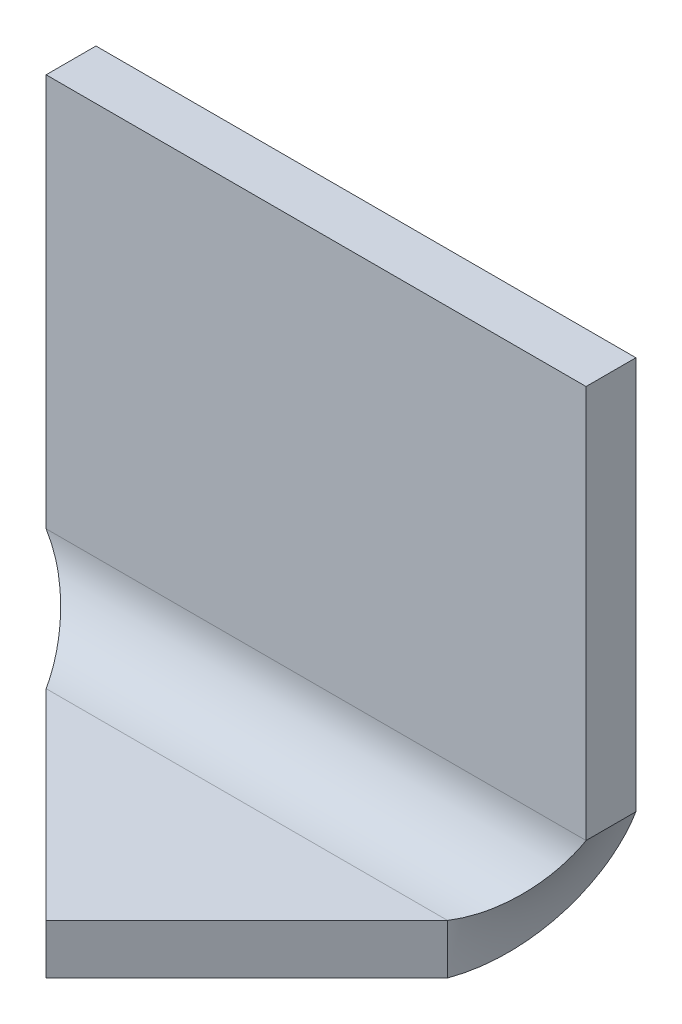
ISO-10303-21;
HEADER;
FILE_DESCRIPTION(('STEP AP214'),'2;1');
FILE_NAME('part.step','',(''),(''),'','','');
FILE_SCHEMA(('AUTOMOTIVE_DESIGN { 1 0 10303 214 1 1 1 1 }'));
ENDSEC;
DATA;
#1=APPLICATION_CONTEXT('core data for automotive mechanical design processes');
#2=APPLICATION_PROTOCOL_DEFINITION('international standard','automotive_design',2000,#1);
#3=PRODUCT_CONTEXT('',#1,'mechanical');
#4=PRODUCT('Part','Part','',(#3));
#5=PRODUCT_RELATED_PRODUCT_CATEGORY('part','',(#4));
#6=PRODUCT_DEFINITION_FORMATION('','',#4);
#7=PRODUCT_DEFINITION_CONTEXT('part definition',#1,'design');
#8=PRODUCT_DEFINITION('design','',#6,#7);
#9=PRODUCT_DEFINITION_SHAPE('','',#8);
#10=(LENGTH_UNIT() NAMED_UNIT(*) SI_UNIT(.MILLI.,.METRE.));
#11=(NAMED_UNIT(*) PLANE_ANGLE_UNIT() SI_UNIT($,.RADIAN.));
#12=(NAMED_UNIT(*) SI_UNIT($,.STERADIAN.) SOLID_ANGLE_UNIT());
#13=UNCERTAINTY_MEASURE_WITH_UNIT(LENGTH_MEASURE(1.E-05),#10,'distance_accuracy_value','');
#14=(GEOMETRIC_REPRESENTATION_CONTEXT(3) GLOBAL_UNCERTAINTY_ASSIGNED_CONTEXT((#13)) GLOBAL_UNIT_ASSIGNED_CONTEXT((#10,
#11,#12)) REPRESENTATION_CONTEXT('',''));
#15=CARTESIAN_POINT('',(0.,0.,0.));
#16=DIRECTION('',(0.,0.,1.));
#17=DIRECTION('',(1.,0.,0.));
#18=AXIS2_PLACEMENT_3D('',#15,#16,#17);
#19=CARTESIAN_POINT('',(9.75,8.35,-1.8));
#20=DIRECTION('',(1.,0.,0.));
#21=DIRECTION('',(0.,1.,0.));
#22=AXIS2_PLACEMENT_3D('',#19,#20,#21);
#23=PLANE('',#22);
#24=DIRECTION('',(0.,1.,0.));
#25=VECTOR('',#24,1.);
#26=CARTESIAN_POINT('',(9.75,8.35,0.));
#27=LINE('',#26,#25);
#28=CARTESIAN_POINT('',(9.75000000000001,-5.85,0.));
#29=VERTEX_POINT('',#28);
#30=CARTESIAN_POINT('',(9.75,8.35,0.));
#31=VERTEX_POINT('',#30);
#32=EDGE_CURVE('E88',#29,#31,#27,.T.);
#33=ORIENTED_EDGE('',*,*,#32,.F.);
#34=DIRECTION('',(0.,0.,-1.));
#35=VECTOR('',#34,1.);
#36=CARTESIAN_POINT('',(9.75000000000001,-5.85,0.));
#37=LINE('',#36,#35);
#38=CARTESIAN_POINT('',(9.75000000000001,-5.85,-1.8));
#39=VERTEX_POINT('',#38);
#40=EDGE_CURVE('E146',#29,#39,#37,.T.);
#41=ORIENTED_EDGE('',*,*,#40,.T.);
#42=DIRECTION('',(0.,1.,0.));
#43=VECTOR('',#42,1.);
#44=CARTESIAN_POINT('',(9.75,8.35,-1.8));
#45=LINE('',#44,#43);
#46=CARTESIAN_POINT('',(9.75,8.35,-1.8));
#47=VERTEX_POINT('',#46);
#48=EDGE_CURVE('E85',#39,#47,#45,.T.);
#49=ORIENTED_EDGE('',*,*,#48,.T.);
#50=DIRECTION('',(0.,0.,1.));
#51=VECTOR('',#50,1.);
#52=CARTESIAN_POINT('',(9.75,8.35,-1.8));
#53=LINE('',#52,#51);
#54=EDGE_CURVE('E43',#47,#31,#53,.T.);
#55=ORIENTED_EDGE('',*,*,#54,.T.);
#56=EDGE_LOOP('',(#33,#41,#49,#55));
#57=FACE_BOUND('',#56,.T.);
#58=ADVANCED_FACE('F40',(#57),#23,.T.);
#59=CARTESIAN_POINT('',(9.75000000000001,-8.35,-1.8));
#60=DIRECTION('',(0.,0.,1.));
#61=DIRECTION('',(1.,0.,0.));
#62=AXIS2_PLACEMENT_3D('',#59,#60,#61);
#63=PLANE('',#62);
#64=DIRECTION('',(1.,0.,0.));
#65=VECTOR('',#64,1.);
#66=CARTESIAN_POINT('',(9.75000000000001,-5.85,-1.8));
#67=LINE('',#66,#65);
#68=CARTESIAN_POINT('',(-9.74999999999999,-5.84999999999999,-1.8));
#69=VERTEX_POINT('',#68);
#70=EDGE_CURVE('E147',#39,#69,#67,.F.);
#71=ORIENTED_EDGE('',*,*,#70,.T.);
#72=DIRECTION('',(0.,-1.,0.));
#73=VECTOR('',#72,1.);
#74=CARTESIAN_POINT('',(-9.75,8.35,-1.8));
#75=LINE('',#74,#73);
#76=CARTESIAN_POINT('',(-9.75,8.35,-1.8));
#77=VERTEX_POINT('',#76);
#78=EDGE_CURVE('E93',#77,#69,#75,.T.);
#79=ORIENTED_EDGE('',*,*,#78,.F.);
#80=DIRECTION('',(-1.,0.,0.));
#81=VECTOR('',#80,1.);
#82=CARTESIAN_POINT('',(-9.75,8.35,-1.8));
#83=LINE('',#82,#81);
#84=EDGE_CURVE('E78',#47,#77,#83,.T.);
#85=ORIENTED_EDGE('',*,*,#84,.F.);
#86=ORIENTED_EDGE('',*,*,#48,.F.);
#87=EDGE_LOOP('',(#71,#79,#85,#86));
#88=FACE_BOUND('',#87,.T.);
#89=ADVANCED_FACE('F181',(#88),#63,.F.);
#90=CARTESIAN_POINT('',(9.75000000000001,-8.35,0.));
#91=DIRECTION('',(0.,0.,1.));
#92=DIRECTION('',(1.,0.,0.));
#93=AXIS2_PLACEMENT_3D('',#90,#91,#92);
#94=PLANE('',#93);
#95=DIRECTION('',(0.,-1.,0.));
#96=VECTOR('',#95,1.);
#97=CARTESIAN_POINT('',(-9.75,8.35,0.));
#98=LINE('',#97,#96);
#99=CARTESIAN_POINT('',(-9.75,8.35,0.));
#100=VERTEX_POINT('',#99);
#101=CARTESIAN_POINT('',(-9.74999999999999,-5.85,0.));
#102=VERTEX_POINT('',#101);
#103=EDGE_CURVE('E80',#100,#102,#98,.T.);
#104=ORIENTED_EDGE('',*,*,#103,.T.);
#105=DIRECTION('',(1.,0.,0.));
#106=VECTOR('',#105,1.);
#107=CARTESIAN_POINT('',(9.75000000000001,-5.85,0.));
#108=LINE('',#107,#106);
#109=EDGE_CURVE('E54',#29,#102,#108,.F.);
#110=ORIENTED_EDGE('',*,*,#109,.F.);
#111=ORIENTED_EDGE('',*,*,#32,.T.);
#112=DIRECTION('',(-1.,0.,0.));
#113=VECTOR('',#112,1.);
#114=CARTESIAN_POINT('',(-9.75,8.35,0.));
#115=LINE('',#114,#113);
#116=EDGE_CURVE('E76',#31,#100,#115,.T.);
#117=ORIENTED_EDGE('',*,*,#116,.T.);
#118=EDGE_LOOP('',(#104,#110,#111,#117));
#119=FACE_BOUND('',#118,.T.);
#120=ADVANCED_FACE('F87',(#119),#94,.T.);
#121=CARTESIAN_POINT('',(-9.75,8.35,-1.8));
#122=DIRECTION('',(-1.,0.,0.));
#123=DIRECTION('',(0.,-1.,0.));
#124=AXIS2_PLACEMENT_3D('',#121,#122,#123);
#125=PLANE('',#124);
#126=DIRECTION('',(0.,0.,-1.));
#127=VECTOR('',#126,1.);
#128=CARTESIAN_POINT('',(-9.74999999999999,-5.85,0.));
#129=LINE('',#128,#127);
#130=EDGE_CURVE('E84',#102,#69,#129,.T.);
#131=ORIENTED_EDGE('',*,*,#130,.F.);
#132=ORIENTED_EDGE('',*,*,#103,.F.);
#133=DIRECTION('',(0.,0.,1.));
#134=VECTOR('',#133,1.);
#135=CARTESIAN_POINT('',(-9.75,8.35,-1.8));
#136=LINE('',#135,#134);
#137=EDGE_CURVE('E11',#77,#100,#136,.T.);
#138=ORIENTED_EDGE('',*,*,#137,.F.);
#139=ORIENTED_EDGE('',*,*,#78,.T.);
#140=EDGE_LOOP('',(#131,#132,#138,#139));
#141=FACE_BOUND('',#140,.T.);
#142=ADVANCED_FACE('F81',(#141),#125,.T.);
#143=CARTESIAN_POINT('',(-9.75,8.35,-1.8));
#144=DIRECTION('',(0.,1.,0.));
#145=DIRECTION('',(0.,0.,1.));
#146=AXIS2_PLACEMENT_3D('',#143,#144,#145);
#147=PLANE('',#146);
#148=ORIENTED_EDGE('',*,*,#116,.F.);
#149=ORIENTED_EDGE('',*,*,#54,.F.);
#150=ORIENTED_EDGE('',*,*,#84,.T.);
#151=ORIENTED_EDGE('',*,*,#137,.T.);
#152=EDGE_LOOP('',(#148,#149,#150,#151));
#153=FACE_BOUND('',#152,.T.);
#154=ADVANCED_FACE('F73',(#153),#147,.T.);
#155=CARTESIAN_POINT('',(-9.74999999999999,-5.85,-1.818));
#156=CARTESIAN_POINT('',(-9.54163356743721,-6.41531460705149,-1.818));
#157=CARTESIAN_POINT('',(-9.33333333333333,-6.98022736466337,-1.70561401785379));
#158=CARTESIAN_POINT('',(-8.91666666666667,-8.02462675724154,-1.27300962491369));
#159=CARTESIAN_POINT('',(-8.70833333333334,-8.50361273685168,-0.952961425475345));
#160=CARTESIAN_POINT('',(-8.29166666666667,-9.30296142547534,-0.153612736851688));
#161=CARTESIAN_POINT('',(-8.08333333333334,-9.62300962491368,0.32537324275845));
#162=CARTESIAN_POINT('',(-7.66666666666667,-10.0556140178538,1.36977263533662));
#163=CARTESIAN_POINT('',(-7.45836643256279,-10.168,1.93468539294851));
#164=CARTESIAN_POINT('',(-7.25000000000001,-10.168,2.49999999999999));
#165=CARTESIAN_POINT('',(-9.74999999999999,-5.85,-1.8));
#166=CARTESIAN_POINT('',(-9.54163363050825,-6.41295793985939,-1.8));
#167=CARTESIAN_POINT('',(-9.33333333333333,-6.97551590274491,-1.68808250967376));
#168=CARTESIAN_POINT('',(-8.91666666666667,-8.01556161559487,-1.25728146992331));
#169=CARTESIAN_POINT('',(-8.70833333333334,-8.49255089589214,-0.938567422312178));
#170=CARTESIAN_POINT('',(-8.29166666666667,-9.28856742231217,-0.14255089589214));
#171=CARTESIAN_POINT('',(-8.08333333333334,-9.60728146992331,0.334438384405126));
#172=CARTESIAN_POINT('',(-7.66666666666667,-10.0380825096738,1.37448409725509));
#173=CARTESIAN_POINT('',(-7.45836636949176,-10.15,1.9370420601406));
#174=CARTESIAN_POINT('',(-7.25000000000001,-10.15,2.49999999999999));
#175=CARTESIAN_POINT('',(-9.74999999999999,-5.85,0.));
#176=CARTESIAN_POINT('',(-9.54163993761184,-6.17729122065008,0.));
#177=CARTESIAN_POINT('',(-9.33333333333333,-6.5043697108982,0.0650683083292108));
#178=CARTESIAN_POINT('',(-8.91666666666667,-7.10904745092725,0.315534029114354));
#179=CARTESIAN_POINT('',(-8.70833333333334,-7.38636679993729,0.500832894004548));
#180=CARTESIAN_POINT('',(-8.29166666666667,-7.84916710599545,0.96363320006271));
#181=CARTESIAN_POINT('',(-8.08333333333334,-8.03446597088565,1.24095254907275));
#182=CARTESIAN_POINT('',(-7.66666666666667,-8.28493169167079,1.84563028910179));
#183=CARTESIAN_POINT('',(-7.45836006238817,-8.35,2.17270877934992));
#184=CARTESIAN_POINT('',(-7.25000000000001,-8.35,2.49999999999999));
#185=CARTESIAN_POINT('',(-9.74999999999999,-5.85,0.01818));
#186=CARTESIAN_POINT('',(-9.54164000131358,-6.17491098678607,0.01818));
#187=CARTESIAN_POINT('',(-9.33333333333333,-6.49961113436055,0.0827751315910408));
#188=CARTESIAN_POINT('',(-8.91666666666667,-7.09989165786411,0.331419465654635));
#189=CARTESIAN_POINT('',(-8.70833333333334,-7.37519434056815,0.515370837199347));
#190=CARTESIAN_POINT('',(-8.29166666666667,-7.83462916280065,0.974805659431854));
#191=CARTESIAN_POINT('',(-8.08333333333334,-8.01858053434537,1.25010834213589));
#192=CARTESIAN_POINT('',(-7.66666666666667,-8.26722486840896,1.85038886563945));
#193=CARTESIAN_POINT('',(-7.45835999868642,-8.33182,2.17508901321393));
#194=CARTESIAN_POINT('',(-7.25000000000001,-8.33182000000001,2.49999999999999));
#195=B_SPLINE_SURFACE_WITH_KNOTS('',1,3,((#155,#156,#157,#158,#159,#160,#161,#162,#163,#164),
(#165,#166,#167,#168,#169,#170,#171,#172,#173,#174),(#175,#176,#177,#178,#179,#180,#181,#182,
#183,#184),(#185,#186,#187,#188,#189,#190,#191,#192,#193,#194)),.UNSPECIFIED.,.F.,.F.,.F.,(2,1,
1,2),(4,2,2,2,4),(-0.01,0.,1.,1.0101),(0.,0.25,0.5,0.75,1.),.UNSPECIFIED.);
#196=DIRECTION('',(0.,-1.,0.));
#197=VECTOR('',#196,1.);
#198=CARTESIAN_POINT('',(-7.25000000000001,-8.35,2.49999999999999));
#199=LINE('',#198,#197);
#200=CARTESIAN_POINT('',(-7.25000000000001,-8.35,2.49999999999999));
#201=VERTEX_POINT('',#200);
#202=CARTESIAN_POINT('',(-7.25000000000001,-10.15,2.49999999999998));
#203=VERTEX_POINT('',#202);
#204=EDGE_CURVE('E216',#201,#203,#199,.T.);
#205=CARTESIAN_POINT('',(-9.74999999999999,-5.85,0.));
#206=CARTESIAN_POINT('',(-9.69689346748578,-5.93341471732264,-1.49475965712688E-05));
#207=CARTESIAN_POINT('',(-9.6437891760293,-6.01682810386367,0.00417418460826415));
#208=CARTESIAN_POINT('',(-9.53758625924466,-6.18281698739911,0.0208529726921105));
#209=CARTESIAN_POINT('',(-9.48448763377486,-6.26539253992683,0.0333420747351834));
#210=CARTESIAN_POINT('',(-9.37832436450476,-6.42882920253477,0.0665025052370035));
#211=CARTESIAN_POINT('',(-9.32525972085639,-6.50969138313284,0.087168555777103));
#212=CARTESIAN_POINT('',(-9.21912949467012,-6.66894398178221,0.136469077563972));
#213=CARTESIAN_POINT('',(-9.16606391216338,-6.74733444171223,0.165103413722094));
#214=CARTESIAN_POINT('',(-9.05987917882861,-6.90093952163055,0.230091643187244));
#215=CARTESIAN_POINT('',(-9.00676002427863,-6.97615110563131,0.266452724739386));
#216=CARTESIAN_POINT('',(-8.90051920398995,-7.12257895409631,0.346510221711344));
#217=CARTESIAN_POINT('',(-8.8473975447601,-7.19379371183902,0.390209378980376));
#218=CARTESIAN_POINT('',(-8.68812180277093,-7.40020831802754,0.531601958653143));
#219=CARTESIAN_POINT('',(-8.58189017579244,-7.52842443945694,0.639695085539194));
#220=CARTESIAN_POINT('',(-8.36942393474517,-7.76076954474149,0.879258154678592));
#221=CARTESIAN_POINT('',(-8.26318932081688,-7.86489725042079,1.01072933676039));
#222=CARTESIAN_POINT('',(-8.10390879624446,-7.99991187225538,1.22137687670553));
#223=CARTESIAN_POINT('',(-8.05078773170796,-8.0414102070923,1.29389175784209));
#224=CARTESIAN_POINT('',(-7.94455011833643,-8.11694763987061,1.44269371573772));
#225=CARTESIAN_POINT('',(-7.8914335762783,-8.15098973120295,1.51897926358996));
#226=CARTESIAN_POINT('',(-7.7892882853158,-8.20895805477079,1.6685839725244));
#227=CARTESIAN_POINT('',(-7.74025896450475,-8.23346048835482,1.74168083721687));
#228=CARTESIAN_POINT('',(-7.6422045934928,-8.27561656681251,1.8898244139619));
#229=CARTESIAN_POINT('',(-7.59317954320336,-8.29327057508985,1.96487102232805));
#230=CARTESIAN_POINT('',(-7.4951325416779,-8.32157338207045,2.11626615524629));
#231=CARTESIAN_POINT('',(-7.44611059049706,-8.33222272496932,2.1926145781869));
#232=CARTESIAN_POINT('',(-7.3480595661092,-8.34644178533052,2.34597487023385));
#233=CARTESIAN_POINT('',(-7.29903049270862,-8.35001073032978,2.42298681080875));
#234=CARTESIAN_POINT('',(-7.25000000000001,-8.35,2.49999999999999));
#235=B_SPLINE_CURVE_WITH_KNOTS('',3,(#205,#206,#207,#208,#209,#210,#211,#212,#213,#214,#215,
#216,#217,#218,#219,#220,#221,#222,#223,#224,#225,#226,#227,#228,#229,#230,#231,#232,#233,#234),
.UNSPECIFIED.,.F.,.F.,(4,2,2,2,2,2,2,2,2,2,2,2,2,2,4),(0.,0.296564077605535,0.59310836822894,
0.889461561883494,1.1858097316828,1.48243481275488,1.77917097449453,2.37171030359051,
2.96428106671021,3.26100786297723,3.55761531577336,3.83143774415031,4.10524564047249,
4.37903226202268,4.65284875172838),.UNSPECIFIED.);
#236=EDGE_CURVE('E106',#102,#201,#235,.T.);
#237=CARTESIAN_POINT('',(-9.74999999999999,-5.85,-1.8));
#238=CARTESIAN_POINT('',(-9.70225924485298,-5.97897878012797,-1.80001680424604));
#239=CARTESIAN_POINT('',(-9.65451962424857,-6.10795541883885,-1.79419762083743));
#240=CARTESIAN_POINT('',(-9.55904504481292,-6.36486014106399,-1.77100851297508));
#241=CARTESIAN_POINT('',(-9.51131008586962,-6.49278828172173,-1.7536392223008));
#242=CARTESIAN_POINT('',(-9.4158799976198,-6.7464650660886,-1.70748949296634));
#243=CARTESIAN_POINT('',(-9.36818486686791,-6.87221536435124,-1.67871815281901));
#244=CARTESIAN_POINT('',(-9.27279098019034,-7.12062175461628,-1.61000297567594));
#245=CARTESIAN_POINT('',(-9.22509222432238,-7.24327788842405,-1.57005928971842));
#246=CARTESIAN_POINT('',(-9.12966236876484,-7.484591745738,-1.47928885079533));
#247=CARTESIAN_POINT('',(-9.08193126944355,-7.60324665491767,-1.42845461525548));
#248=CARTESIAN_POINT('',(-8.98645175519196,-7.83555217301651,-1.31631028281866));
#249=CARTESIAN_POINT('',(-8.93870334035657,-7.94920092339411,-1.25499633586355));
#250=CARTESIAN_POINT('',(-8.84324037513162,-8.17045919285757,-1.12244254655683));
#251=CARTESIAN_POINT('',(-8.79552582228014,-8.27807245381655,-1.05120895176739));
#252=CARTESIAN_POINT('',(-8.70007666924669,-8.48650065170471,-0.899337736152186));
#253=CARTESIAN_POINT('',(-8.65234206785809,-8.58731321428083,-0.818696857471334));
#254=CARTESIAN_POINT('',(-8.55688435735615,-8.78125938099435,-0.648704841297677));
#255=CARTESIAN_POINT('',(-8.50916124843976,-8.87439495057984,-0.559355946077695));
#256=CARTESIAN_POINT('',(-8.41371428390969,-9.05226298793858,-0.372653065773702));
#257=CARTESIAN_POINT('',(-8.36599042829594,-9.13699545486907,-0.275299079886854));
#258=CARTESIAN_POINT('',(-8.27051763543878,-9.29742233687133,-0.0733098058252709));
#259=CARTESIAN_POINT('',(-8.22276870074105,-9.37311118317632,0.0313299065424317));
#260=CARTESIAN_POINT('',(-8.12728669520336,-9.5147517755456,0.246951540999978));
#261=CARTESIAN_POINT('',(-8.07955362461625,-9.58070689586819,0.357931246697754));
#262=CARTESIAN_POINT('',(-7.98404363044855,-9.70242912679469,0.585463266683108));
#263=CARTESIAN_POINT('',(-7.93626670395728,-9.75818756398757,0.702020219705517));
#264=CARTESIAN_POINT('',(-7.84073099509376,-9.85897766257981,0.939632749694492));
#265=CARTESIAN_POINT('',(-7.79297221259841,-9.90401331578795,1.06068663311061));
#266=CARTESIAN_POINT('',(-7.69750528764938,-9.98298018950692,1.30622822617006));
#267=CARTESIAN_POINT('',(-7.6497971423269,-10.0169224724752,1.43071237991189));
#268=CARTESIAN_POINT('',(-7.55440123371481,-10.0734780340213,1.68217889332977));
#269=CARTESIAN_POINT('',(-7.50671347094629,-10.0960964198156,1.80916009989964));
#270=CARTESIAN_POINT('',(-7.4241607858688,-10.1253060890314,2.03028129094245));
#271=CARTESIAN_POINT('',(-7.38929392218526,-10.1345709698379,2.12407628662179));
#272=CARTESIAN_POINT('',(-7.31961899062782,-10.1469143493546,2.31191155085282));
#273=CARTESIAN_POINT('',(-7.28481092384374,-10.1500033666422,2.40595112875835));
#274=CARTESIAN_POINT('',(-7.25000000000001,-10.15,2.49999999999999));
#275=B_SPLINE_CURVE_WITH_KNOTS('',3,(#237,#238,#239,#240,#241,#242,#243,#244,#245,#246,#247,
#248,#249,#250,#251,#252,#253,#254,#255,#256,#257,#258,#259,#260,#261,#262,#263,#264,#265,#266,
#267,#268,#269,#270,#271,#272,#273,#274),.UNSPECIFIED.,.F.,.F.,(4,2,2,2,2,2,2,2,2,2,2,2,2,2,2,2,
2,2,4),(0.,0.412465798621927,0.824908966217266,1.23702367640294,1.64913281550632,
2.06152601591327,2.47407104913171,2.88635741985317,3.29878699653219,3.71111065373709,
4.12343435229431,4.53601065198252,4.94844359180705,5.36122573619579,5.77385397160237,
6.18606946412173,6.59809887453587,6.8993994397719,7.20018639871136),.UNSPECIFIED.);
#276=EDGE_CURVE('E140',#69,#203,#275,.T.);
#277=ORIENTED_EDGE('',*,*,#204,.F.);
#278=ORIENTED_EDGE('',*,*,#236,.F.);
#279=ORIENTED_EDGE('',*,*,#130,.T.);
#280=ORIENTED_EDGE('',*,*,#276,.T.);
#281=EDGE_LOOP('',(#277,#278,#279,#280));
#282=FACE_BOUND('',#281,.T.);
#283=ADVANCED_FACE('F126',(#282),#195,.F.);
#284=CARTESIAN_POINT('',(7.25000000000003,-10.168,2.49999999999998));
#285=CARTESIAN_POINT('',(7.45836643256281,-10.168,1.9346853929485));
#286=CARTESIAN_POINT('',(7.66666666666669,-10.0556140178538,1.36977263533661));
#287=CARTESIAN_POINT('',(8.08333333333335,-9.62300962491368,0.325373242758445));
#288=CARTESIAN_POINT('',(8.29166666666669,-9.30296142547534,-0.153612736851693));
#289=CARTESIAN_POINT('',(8.70833333333335,-8.50361273685168,-0.952961425475349));
#290=CARTESIAN_POINT('',(8.91666666666668,-8.02462675724154,-1.27300962491369));
#291=CARTESIAN_POINT('',(9.33333333333334,-6.98022736466337,-1.70561401785379));
#292=CARTESIAN_POINT('',(9.54163356743722,-6.41531460705148,-1.818));
#293=CARTESIAN_POINT('',(9.75000000000001,-5.85,-1.818));
#294=CARTESIAN_POINT('',(7.25000000000003,-10.15,2.49999999999998));
#295=CARTESIAN_POINT('',(7.45836636949177,-10.15,1.9370420601406));
#296=CARTESIAN_POINT('',(7.66666666666669,-10.0380825096738,1.37448409725508));
#297=CARTESIAN_POINT('',(8.08333333333335,-9.60728146992331,0.334438384405121));
#298=CARTESIAN_POINT('',(8.29166666666669,-9.28856742231217,-0.142550895892144));
#299=CARTESIAN_POINT('',(8.70833333333335,-8.49255089589214,-0.938567422312182));
#300=CARTESIAN_POINT('',(8.91666666666668,-8.01556161559487,-1.25728146992331));
#301=CARTESIAN_POINT('',(9.33333333333334,-6.97551590274491,-1.68808250967376));
#302=CARTESIAN_POINT('',(9.54163363050826,-6.41295793985939,-1.8));
#303=CARTESIAN_POINT('',(9.75000000000001,-5.85,-1.8));
#304=CARTESIAN_POINT('',(7.25000000000003,-8.35,2.49999999999999));
#305=CARTESIAN_POINT('',(7.45836006238818,-8.35,2.17270877934991));
#306=CARTESIAN_POINT('',(7.66666666666669,-8.28493169167079,1.84563028910179));
#307=CARTESIAN_POINT('',(8.08333333333335,-8.03446597088565,1.24095254907274));
#308=CARTESIAN_POINT('',(8.29166666666669,-7.84916710599545,0.963633200062705));
#309=CARTESIAN_POINT('',(8.70833333333335,-7.38636679993729,0.500832894004544));
#310=CARTESIAN_POINT('',(8.91666666666668,-7.10904745092725,0.315534029114351));
#311=CARTESIAN_POINT('',(9.33333333333334,-6.5043697108982,0.0650683083292074));
#312=CARTESIAN_POINT('',(9.54163993761185,-6.17729122065008,0.));
#313=CARTESIAN_POINT('',(9.75000000000001,-5.85,0.));
#314=CARTESIAN_POINT('',(7.25000000000003,-8.33182000000001,2.49999999999999));
#315=CARTESIAN_POINT('',(7.45835999868644,-8.33182,2.17508901321393));
#316=CARTESIAN_POINT('',(7.66666666666669,-8.26722486840896,1.85038886563944));
#317=CARTESIAN_POINT('',(8.08333333333335,-8.01858053434537,1.25010834213589));
#318=CARTESIAN_POINT('',(8.29166666666669,-7.83462916280065,0.974805659431849));
#319=CARTESIAN_POINT('',(8.70833333333335,-7.37519434056815,0.515370837199343));
#320=CARTESIAN_POINT('',(8.91666666666668,-7.09989165786411,0.331419465654631));
#321=CARTESIAN_POINT('',(9.33333333333334,-6.49961113436055,0.0827751315910374));
#322=CARTESIAN_POINT('',(9.5416400013136,-6.17491098678606,0.0181799999999966));
#323=CARTESIAN_POINT('',(9.75000000000001,-5.85,0.0181799999999965));
#324=B_SPLINE_SURFACE_WITH_KNOTS('',1,3,((#284,#285,#286,#287,#288,#289,#290,#291,#292,#293),
(#294,#295,#296,#297,#298,#299,#300,#301,#302,#303),(#304,#305,#306,#307,#308,#309,#310,#311,
#312,#313),(#314,#315,#316,#317,#318,#319,#320,#321,#322,#323)),.UNSPECIFIED.,.F.,.F.,.F.,(2,1,
1,2),(4,2,2,2,4),(-0.01,0.,1.,1.0101),(0.,0.25,0.5,0.75,1.),.UNSPECIFIED.);
#325=CARTESIAN_POINT('',(7.25000000000003,-8.35,2.49999999999999));
#326=CARTESIAN_POINT('',(7.30310653251424,-8.35001494759658,2.41658528267735));
#327=CARTESIAN_POINT('',(7.35621082397072,-8.34582581539174,2.33317189613633));
#328=CARTESIAN_POINT('',(7.46241374075536,-8.32914702730789,2.16718301260088));
#329=CARTESIAN_POINT('',(7.51551236622516,-8.31665792526482,2.08460746007316));
#330=CARTESIAN_POINT('',(7.62167563549526,-8.283497494763,1.92117079746523));
#331=CARTESIAN_POINT('',(7.67474027914362,-8.2628314442229,1.84030861686716));
#332=CARTESIAN_POINT('',(7.78087050532989,-8.21353092243603,1.68105601821778));
#333=CARTESIAN_POINT('',(7.83393608783664,-8.18489658627791,1.60266555828777));
#334=CARTESIAN_POINT('',(7.9401208211714,-8.11990835681276,1.44906047836945));
#335=CARTESIAN_POINT('',(7.99323997572139,-8.08354727526062,1.37384889436868));
#336=CARTESIAN_POINT('',(8.09948079601007,-8.00348977828866,1.22742104590369));
#337=CARTESIAN_POINT('',(8.15260245523992,-7.95979062101962,1.15620628816097));
#338=CARTESIAN_POINT('',(8.31187819722909,-7.81839804134686,0.949791681972456));
#339=CARTESIAN_POINT('',(8.41810982420758,-7.71030491446081,0.821575560543062));
#340=CARTESIAN_POINT('',(8.63057606525485,-7.47074184532141,0.58923045525851));
#341=CARTESIAN_POINT('',(8.73681067918313,-7.33927066323961,0.485102749579206));
#342=CARTESIAN_POINT('',(8.89609120375555,-7.12862312329447,0.350088127744618));
#343=CARTESIAN_POINT('',(8.94921226829205,-7.05610824215791,0.308589792907702));
#344=CARTESIAN_POINT('',(9.05544988166358,-6.90730628426228,0.233052360129392));
#345=CARTESIAN_POINT('',(9.10856642372171,-6.83102073641004,0.199010268797055));
#346=CARTESIAN_POINT('',(9.21071171468421,-6.6814160274756,0.141041945229214));
#347=CARTESIAN_POINT('',(9.25974103549527,-6.60831916278313,0.116539511645182));
#348=CARTESIAN_POINT('',(9.35779540650721,-6.4601755860381,0.0743834331874852));
#349=CARTESIAN_POINT('',(9.40682045679666,-6.38512897767194,0.0567294249101506));
#350=CARTESIAN_POINT('',(9.50486745832212,-6.2337338447537,0.0284266179295491));
#351=CARTESIAN_POINT('',(9.55388940950295,-6.1573854218131,0.017777275030678));
#352=CARTESIAN_POINT('',(9.65194043389082,-6.00402512976615,0.00355821466947751));
#353=CARTESIAN_POINT('',(9.7009695072914,-5.92701318919125,-1.07303297851442E-05));
#354=CARTESIAN_POINT('',(9.75000000000001,-5.85,0.));
#355=B_SPLINE_CURVE_WITH_KNOTS('',3,(#325,#326,#327,#328,#329,#330,#331,#332,#333,#334,#335,
#336,#337,#338,#339,#340,#341,#342,#343,#344,#345,#346,#347,#348,#349,#350,#351,#352,#353,#354),
.UNSPECIFIED.,.F.,.F.,(4,2,2,2,2,2,2,2,2,2,2,2,2,2,4),(0.,0.296564077605533,0.593108368228936,
0.889461561883488,1.18580973168279,1.48243481275488,1.77917097449452,2.37171030359051,
2.9642810667102,3.26100786297722,3.55761531577336,3.8314377441503,4.10524564047248,
4.37903226202267,4.65284875172837),.UNSPECIFIED.);
#356=CARTESIAN_POINT('',(7.25000000000003,-8.35,2.49999999999999));
#357=VERTEX_POINT('',#356);
#358=EDGE_CURVE('E97',#357,#29,#355,.T.);
#359=DIRECTION('',(0.,-1.,0.));
#360=VECTOR('',#359,1.);
#361=CARTESIAN_POINT('',(7.25000000000003,-8.35,2.49999999999999));
#362=LINE('',#361,#360);
#363=CARTESIAN_POINT('',(7.25000000000003,-10.15,2.49999999999998));
#364=VERTEX_POINT('',#363);
#365=EDGE_CURVE('E222',#357,#364,#362,.T.);
#366=CARTESIAN_POINT('',(7.25000000000003,-10.15,2.49999999999998));
#367=CARTESIAN_POINT('',(7.29774075514703,-10.150016804246,2.37102121987202));
#368=CARTESIAN_POINT('',(7.34548037575145,-10.1441976208374,2.24204458116114));
#369=CARTESIAN_POINT('',(7.4409549551871,-10.1210085129751,1.98513985893599));
#370=CARTESIAN_POINT('',(7.48868991413041,-10.1036392223008,1.85721171827826));
#371=CARTESIAN_POINT('',(7.58412000238023,-10.0574894929663,1.60353493391139));
#372=CARTESIAN_POINT('',(7.63181513313211,-10.028718152819,1.47778463564875));
#373=CARTESIAN_POINT('',(7.72720901980968,-9.96000297567594,1.2293782453837));
#374=CARTESIAN_POINT('',(7.77490777567764,-9.92005928971842,1.10672211157593));
#375=CARTESIAN_POINT('',(7.87033763123518,-9.82928885079533,0.865408254261991));
#376=CARTESIAN_POINT('',(7.91806873055646,-9.77845461525548,0.746753345082318));
#377=CARTESIAN_POINT('',(8.01354824480806,-9.66631028281866,0.514447826983475));
#378=CARTESIAN_POINT('',(8.06129665964345,-9.60499633586355,0.400799076605883));
#379=CARTESIAN_POINT('',(8.1567596248684,-9.47244254655682,0.179540807142416));
#380=CARTESIAN_POINT('',(8.20447417771989,-9.40120895176738,0.0719275461834362));
#381=CARTESIAN_POINT('',(8.29992333075333,-9.24933773615218,-0.136500651704715));
#382=CARTESIAN_POINT('',(8.34765793214193,-9.16869685747133,-0.237313214280839));
#383=CARTESIAN_POINT('',(8.44311564264387,-8.99870484129767,-0.431259380994354));
#384=CARTESIAN_POINT('',(8.49083875156026,-8.90935594607769,-0.524394950579851));
#385=CARTESIAN_POINT('',(8.58628571609033,-8.7226530657737,-0.702262987938589));
#386=CARTESIAN_POINT('',(8.63400957170408,-8.62529907988685,-0.786995454869074));
#387=CARTESIAN_POINT('',(8.72948236456124,-8.42330980582527,-0.947422336871338));
#388=CARTESIAN_POINT('',(8.77723129925897,-8.31867009345756,-1.02311118317633));
#389=CARTESIAN_POINT('',(8.87271330479666,-8.10304845900002,-1.1647517755456));
#390=CARTESIAN_POINT('',(8.92044637538377,-7.99206875330224,-1.2307068958682));
#391=CARTESIAN_POINT('',(9.01595636955147,-7.76453673331689,-1.3524291267947));
#392=CARTESIAN_POINT('',(9.06373329604274,-7.64797978029448,-1.40818756398757));
#393=CARTESIAN_POINT('',(9.15926900490626,-7.4103672503055,-1.50897766257982));
#394=CARTESIAN_POINT('',(9.2070277874016,-7.28931336688938,-1.55401331578795));
#395=CARTESIAN_POINT('',(9.30249471235064,-7.04377177382993,-1.63298018950692));
#396=CARTESIAN_POINT('',(9.35020285767312,-6.9192876200881,-1.66692247247522));
#397=CARTESIAN_POINT('',(9.44559876628521,-6.66782110667023,-1.72347803402127));
#398=CARTESIAN_POINT('',(9.49328652905372,-6.54083990010035,-1.7460964198156));
#399=CARTESIAN_POINT('',(9.57583921413122,-6.31971870905755,-1.77530608903143));
#400=CARTESIAN_POINT('',(9.61070607781476,-6.2259237133782,-1.78457096983789));
#401=CARTESIAN_POINT('',(9.68038100937219,-6.03808844914717,-1.7969143493546));
#402=CARTESIAN_POINT('',(9.71518907615627,-5.94404887124164,-1.80000336664222));
#403=CARTESIAN_POINT('',(9.75000000000001,-5.85,-1.8));
#404=B_SPLINE_CURVE_WITH_KNOTS('',3,(#366,#367,#368,#369,#370,#371,#372,#373,#374,#375,#376,
#377,#378,#379,#380,#381,#382,#383,#384,#385,#386,#387,#388,#389,#390,#391,#392,#393,#394,#395,
#396,#397,#398,#399,#400,#401,#402,#403),.UNSPECIFIED.,.F.,.F.,(4,2,2,2,2,2,2,2,2,2,2,2,2,2,2,2,
2,2,4),(0.,0.412465798621927,0.824908966217267,1.23702367640294,1.64913281550632,
2.06152601591327,2.47407104913171,2.88635741985317,3.29878699653219,3.71111065373709,
4.12343435229431,4.53601065198252,4.94844359180705,5.36122573619578,5.77385397160236,
6.18606946412172,6.59809887453587,6.8993994397719,7.20018639871135),.UNSPECIFIED.);
#405=EDGE_CURVE('E149',#364,#39,#404,.T.);
#406=ORIENTED_EDGE('',*,*,#358,.F.);
#407=ORIENTED_EDGE('',*,*,#365,.T.);
#408=ORIENTED_EDGE('',*,*,#405,.T.);
#409=ORIENTED_EDGE('',*,*,#40,.F.);
#410=EDGE_LOOP('',(#406,#407,#408,#409));
#411=FACE_BOUND('',#410,.T.);
#412=ADVANCED_FACE('F112',(#411),#324,.F.);
#413=CARTESIAN_POINT('',(9.75000000000001,-5.85,2.5));
#414=DIRECTION('',(1.,0.,0.));
#415=DIRECTION('',(0.,-1.,0.));
#416=AXIS2_PLACEMENT_3D('',#413,#414,#415);
#417=CYLINDRICAL_SURFACE('',#416,4.3);
#418=ORIENTED_EDGE('',*,*,#70,.F.);
#419=ORIENTED_EDGE('',*,*,#405,.F.);
#420=DIRECTION('',(-1.,0.,0.));
#421=VECTOR('',#420,1.);
#422=CARTESIAN_POINT('',(0.,-10.15,2.49999999999998));
#423=LINE('',#422,#421);
#424=EDGE_CURVE('E204',#364,#203,#423,.T.);
#425=ORIENTED_EDGE('',*,*,#424,.T.);
#426=ORIENTED_EDGE('',*,*,#276,.F.);
#427=EDGE_LOOP('',(#418,#419,#425,#426));
#428=FACE_BOUND('',#427,.T.);
#429=ADVANCED_FACE('F122',(#428),#417,.T.);
#430=CARTESIAN_POINT('',(9.75000000000001,-5.85,2.5));
#431=DIRECTION('',(1.,0.,0.));
#432=DIRECTION('',(0.,-1.,0.));
#433=AXIS2_PLACEMENT_3D('',#430,#431,#432);
#434=CYLINDRICAL_SURFACE('',#433,2.5);
#435=ORIENTED_EDGE('',*,*,#109,.T.);
#436=ORIENTED_EDGE('',*,*,#236,.T.);
#437=DIRECTION('',(1.,0.,0.));
#438=VECTOR('',#437,1.);
#439=CARTESIAN_POINT('',(-7.25000000000001,-8.35,2.49999999999999));
#440=LINE('',#439,#438);
#441=EDGE_CURVE('E223',#201,#357,#440,.T.);
#442=ORIENTED_EDGE('',*,*,#441,.T.);
#443=ORIENTED_EDGE('',*,*,#358,.T.);
#444=EDGE_LOOP('',(#435,#436,#442,#443));
#445=FACE_BOUND('',#444,.T.);
#446=ADVANCED_FACE('F117',(#445),#434,.F.);
#447=CARTESIAN_POINT('',(-9.74999999999999,-10.15,0.));
#448=DIRECTION('',(0.707106781186549,0.,-0.707106781186546));
#449=DIRECTION('',(-0.707106781186546,0.,-0.707106781186549));
#450=AXIS2_PLACEMENT_3D('',#447,#448,#449);
#451=PLANE('',#450);
#452=ORIENTED_EDGE('',*,*,#204,.T.);
#453=DIRECTION('',(-0.707106781186546,0.,-0.707106781186549));
#454=VECTOR('',#453,1.);
#455=CARTESIAN_POINT('',(-9.74999999999999,-10.15,0.));
#456=LINE('',#455,#454);
#457=CARTESIAN_POINT('',(0.,-10.15,9.75000000000003));
#458=VERTEX_POINT('',#457);
#459=EDGE_CURVE('E203',#458,#203,#456,.T.);
#460=ORIENTED_EDGE('',*,*,#459,.F.);
#461=DIRECTION('',(0.,1.,0.));
#462=VECTOR('',#461,1.);
#463=CARTESIAN_POINT('',(0.,-10.15,9.75000000000003));
#464=LINE('',#463,#462);
#465=CARTESIAN_POINT('',(0.,-8.35000000000003,9.75000000000004));
#466=VERTEX_POINT('',#465);
#467=EDGE_CURVE('E105',#458,#466,#464,.T.);
#468=ORIENTED_EDGE('',*,*,#467,.T.);
#469=DIRECTION('',(-0.707106781186546,0.,-0.707106781186549));
#470=VECTOR('',#469,1.);
#471=CARTESIAN_POINT('',(-9.74999999999999,-8.35,0.));
#472=LINE('',#471,#470);
#473=EDGE_CURVE('E218',#466,#201,#472,.T.);
#474=ORIENTED_EDGE('',*,*,#473,.T.);
#475=EDGE_LOOP('',(#452,#460,#468,#474));
#476=FACE_BOUND('',#475,.T.);
#477=ADVANCED_FACE('F121',(#476),#451,.F.);
#478=CARTESIAN_POINT('',(0.,-10.15,9.75000000000003));
#479=DIRECTION('',(-0.707106781186549,0.,-0.707106781186546));
#480=DIRECTION('',(-0.707106781186546,0.,0.707106781186549));
#481=AXIS2_PLACEMENT_3D('',#478,#479,#480);
#482=PLANE('',#481);
#483=ORIENTED_EDGE('',*,*,#365,.F.);
#484=DIRECTION('',(-0.707106781186546,0.,0.707106781186549));
#485=VECTOR('',#484,1.);
#486=CARTESIAN_POINT('',(0.,-8.35000000000003,9.75000000000004));
#487=LINE('',#486,#485);
#488=EDGE_CURVE('E211',#357,#466,#487,.T.);
#489=ORIENTED_EDGE('',*,*,#488,.T.);
#490=ORIENTED_EDGE('',*,*,#467,.F.);
#491=DIRECTION('',(-0.707106781186546,0.,0.707106781186549));
#492=VECTOR('',#491,1.);
#493=CARTESIAN_POINT('',(0.,-10.15,9.75000000000003));
#494=LINE('',#493,#492);
#495=EDGE_CURVE('E199',#364,#458,#494,.T.);
#496=ORIENTED_EDGE('',*,*,#495,.F.);
#497=EDGE_LOOP('',(#483,#489,#490,#496));
#498=FACE_BOUND('',#497,.T.);
#499=ADVANCED_FACE('F209',(#498),#482,.F.);
#500=CARTESIAN_POINT('',(0.,-10.15,9.75000000000003));
#501=DIRECTION('',(0.,1.,0.));
#502=DIRECTION('',(0.,0.,1.));
#503=AXIS2_PLACEMENT_3D('',#500,#501,#502);
#504=PLANE('',#503);
#505=ORIENTED_EDGE('',*,*,#424,.F.);
#506=ORIENTED_EDGE('',*,*,#495,.T.);
#507=ORIENTED_EDGE('',*,*,#459,.T.);
#508=EDGE_LOOP('',(#505,#506,#507));
#509=FACE_BOUND('',#508,.T.);
#510=ADVANCED_FACE('F201',(#509),#504,.F.);
#511=CARTESIAN_POINT('',(0.,-8.35000000000003,9.75000000000004));
#512=DIRECTION('',(0.,1.,0.));
#513=DIRECTION('',(0.,0.,1.));
#514=AXIS2_PLACEMENT_3D('',#511,#512,#513);
#515=PLANE('',#514);
#516=ORIENTED_EDGE('',*,*,#488,.F.);
#517=ORIENTED_EDGE('',*,*,#441,.F.);
#518=ORIENTED_EDGE('',*,*,#473,.F.);
#519=EDGE_LOOP('',(#516,#517,#518));
#520=FACE_BOUND('',#519,.T.);
#521=ADVANCED_FACE('F227',(#520),#515,.T.);
#522=CLOSED_SHELL('',(#58,#89,#120,#142,#154,#283,#412,#429,#446,#477,#499,#510,#521));
#523=MANIFOLD_SOLID_BREP('B2',#522);
#524=ADVANCED_BREP_SHAPE_REPRESENTATION('',(#18,#523),#14);
#525=SHAPE_DEFINITION_REPRESENTATION(#9,#524);
ENDSEC;
END-ISO-10303-21;
